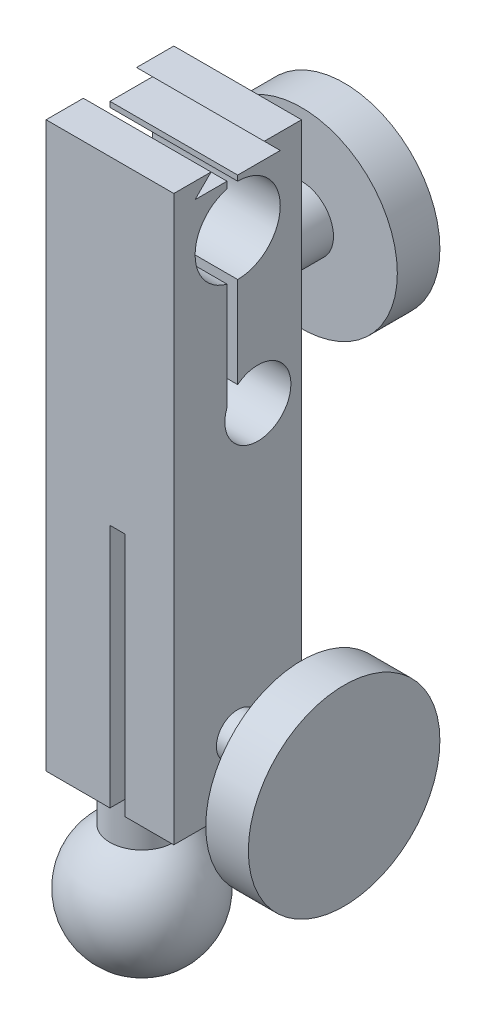
ISO-10303-21;
HEADER;
FILE_DESCRIPTION(('STEP AP214'),'2;1');
FILE_NAME('part.step','',(''),(''),'','','');
FILE_SCHEMA(('AUTOMOTIVE_DESIGN { 1 0 10303 214 1 1 1 1 }'));
ENDSEC;
DATA;
#1=APPLICATION_CONTEXT('core data for automotive mechanical design processes');
#2=APPLICATION_PROTOCOL_DEFINITION('international standard','automotive_design',2000,#1);
#3=PRODUCT_CONTEXT('',#1,'mechanical');
#4=PRODUCT('Part','Part','',(#3));
#5=PRODUCT_RELATED_PRODUCT_CATEGORY('part','',(#4));
#6=PRODUCT_DEFINITION_FORMATION('','',#4);
#7=PRODUCT_DEFINITION_CONTEXT('part definition',#1,'design');
#8=PRODUCT_DEFINITION('design','',#6,#7);
#9=PRODUCT_DEFINITION_SHAPE('','',#8);
#10=(LENGTH_UNIT() NAMED_UNIT(*) SI_UNIT(.MILLI.,.METRE.));
#11=(NAMED_UNIT(*) PLANE_ANGLE_UNIT() SI_UNIT($,.RADIAN.));
#12=(NAMED_UNIT(*) SI_UNIT($,.STERADIAN.) SOLID_ANGLE_UNIT());
#13=UNCERTAINTY_MEASURE_WITH_UNIT(LENGTH_MEASURE(1.E-05),#10,'distance_accuracy_value','');
#14=(GEOMETRIC_REPRESENTATION_CONTEXT(3) GLOBAL_UNCERTAINTY_ASSIGNED_CONTEXT((#13)) GLOBAL_UNIT_ASSIGNED_CONTEXT((#10,
#11,#12)) REPRESENTATION_CONTEXT('',''));
#15=CARTESIAN_POINT('',(0.,0.,0.));
#16=DIRECTION('',(0.,0.,1.));
#17=DIRECTION('',(1.,0.,0.));
#18=AXIS2_PLACEMENT_3D('',#15,#16,#17);
#19=CARTESIAN_POINT('',(-3.,64.,-2.5));
#20=DIRECTION('',(0.,1.,0.));
#21=DIRECTION('',(1.,0.,0.));
#22=AXIS2_PLACEMENT_3D('',#19,#20,#21);
#23=PLANE('',#22);
#24=DIRECTION('',(1.,0.,0.));
#25=VECTOR('',#24,1.);
#26=CARTESIAN_POINT('',(-3.,64.,-2.5));
#27=LINE('',#26,#25);
#28=CARTESIAN_POINT('',(9.,64.,-2.5));
#29=VERTEX_POINT('',#28);
#30=CARTESIAN_POINT('',(-3.,64.,-2.5));
#31=VERTEX_POINT('',#30);
#32=EDGE_CURVE('E162',#29,#31,#27,.F.);
#33=ORIENTED_EDGE('',*,*,#32,.F.);
#34=DIRECTION('',(0.,0.,-1.));
#35=VECTOR('',#34,1.);
#36=CARTESIAN_POINT('',(9.,64.,-2.5));
#37=LINE('',#36,#35);
#38=CARTESIAN_POINT('',(9.,64.,-6.));
#39=VERTEX_POINT('',#38);
#40=EDGE_CURVE('E177',#29,#39,#37,.T.);
#41=ORIENTED_EDGE('',*,*,#40,.T.);
#42=DIRECTION('',(-1.,0.,0.));
#43=VECTOR('',#42,1.);
#44=CARTESIAN_POINT('',(9.,64.,-6.));
#45=LINE('',#44,#43);
#46=CARTESIAN_POINT('',(-3.,64.,-6.));
#47=VERTEX_POINT('',#46);
#48=EDGE_CURVE('E186',#39,#47,#45,.T.);
#49=ORIENTED_EDGE('',*,*,#48,.T.);
#50=DIRECTION('',(0.,0.,1.));
#51=VECTOR('',#50,1.);
#52=CARTESIAN_POINT('',(-3.,64.,-6.));
#53=LINE('',#52,#51);
#54=EDGE_CURVE('E179',#31,#47,#53,.F.);
#55=ORIENTED_EDGE('',*,*,#54,.F.);
#56=EDGE_LOOP('',(#33,#41,#49,#55));
#57=FACE_BOUND('',#56,.T.);
#58=ADVANCED_FACE('F17',(#57),#23,.T.);
#59=CARTESIAN_POINT('',(-3.,64.,6.));
#60=DIRECTION('',(0.,1.,0.));
#61=DIRECTION('',(1.,0.,0.));
#62=AXIS2_PLACEMENT_3D('',#59,#60,#61);
#63=PLANE('',#62);
#64=DIRECTION('',(-1.,0.,0.));
#65=VECTOR('',#64,1.);
#66=CARTESIAN_POINT('',(9.,64.,2.5));
#67=LINE('',#66,#65);
#68=CARTESIAN_POINT('',(9.,64.,2.5));
#69=VERTEX_POINT('',#68);
#70=CARTESIAN_POINT('',(-3.,64.,2.5));
#71=VERTEX_POINT('',#70);
#72=EDGE_CURVE('E197',#69,#71,#67,.T.);
#73=ORIENTED_EDGE('',*,*,#72,.T.);
#74=DIRECTION('',(0.,0.,1.));
#75=VECTOR('',#74,1.);
#76=CARTESIAN_POINT('',(-3.,64.,2.5));
#77=LINE('',#76,#75);
#78=CARTESIAN_POINT('',(-3.,64.,6.));
#79=VERTEX_POINT('',#78);
#80=EDGE_CURVE('E202',#79,#71,#77,.F.);
#81=ORIENTED_EDGE('',*,*,#80,.F.);
#82=DIRECTION('',(1.,0.,0.));
#83=VECTOR('',#82,1.);
#84=CARTESIAN_POINT('',(-3.,64.,6.));
#85=LINE('',#84,#83);
#86=CARTESIAN_POINT('',(9.,64.,6.));
#87=VERTEX_POINT('',#86);
#88=EDGE_CURVE('E207',#87,#79,#85,.F.);
#89=ORIENTED_EDGE('',*,*,#88,.F.);
#90=DIRECTION('',(0.,0.,-1.));
#91=VECTOR('',#90,1.);
#92=CARTESIAN_POINT('',(9.,64.,6.));
#93=LINE('',#92,#91);
#94=EDGE_CURVE('E211',#87,#69,#93,.T.);
#95=ORIENTED_EDGE('',*,*,#94,.T.);
#96=EDGE_LOOP('',(#73,#81,#89,#95));
#97=FACE_BOUND('',#96,.T.);
#98=ADVANCED_FACE('F538',(#97),#63,.T.);
#99=CARTESIAN_POINT('',(-3.,11.,6.));
#100=DIRECTION('',(-1.,0.,0.));
#101=DIRECTION('',(0.,1.,0.));
#102=AXIS2_PLACEMENT_3D('',#99,#100,#101);
#103=PLANE('',#102);
#104=DIRECTION('',(0.,0.707106781186548,0.707106781186547));
#105=VECTOR('',#104,1.);
#106=CARTESIAN_POINT('',(-3.,62.5,-4.));
#107=LINE('',#106,#105);
#108=CARTESIAN_POINT('',(-3.,62.5,-4.));
#109=VERTEX_POINT('',#108);
#110=EDGE_CURVE('E216',#109,#31,#107,.T.);
#111=ORIENTED_EDGE('',*,*,#110,.T.);
#112=ORIENTED_EDGE('',*,*,#54,.T.);
#113=DIRECTION('',(0.,-1.,0.));
#114=VECTOR('',#113,1.);
#115=CARTESIAN_POINT('',(-3.,64.,-6.));
#116=LINE('',#115,#114);
#117=CARTESIAN_POINT('',(-3.,11.,-6.));
#118=VERTEX_POINT('',#117);
#119=EDGE_CURVE('E220',#47,#118,#116,.T.);
#120=ORIENTED_EDGE('',*,*,#119,.T.);
#121=DIRECTION('',(0.,0.,1.));
#122=VECTOR('',#121,1.);
#123=CARTESIAN_POINT('',(-3.,11.,-6.));
#124=LINE('',#123,#122);
#125=CARTESIAN_POINT('',(-3.,11.,0.));
#126=VERTEX_POINT('',#125);
#127=EDGE_CURVE('E225',#126,#118,#124,.F.);
#128=ORIENTED_EDGE('',*,*,#127,.F.);
#129=DIRECTION('',(0.,0.,1.));
#130=VECTOR('',#129,1.);
#131=CARTESIAN_POINT('',(-3.,11.,0.));
#132=LINE('',#131,#130);
#133=CARTESIAN_POINT('',(-3.,11.,6.));
#134=VERTEX_POINT('',#133);
#135=EDGE_CURVE('E230',#134,#126,#132,.F.);
#136=ORIENTED_EDGE('',*,*,#135,.F.);
#137=DIRECTION('',(0.,1.,0.));
#138=VECTOR('',#137,1.);
#139=CARTESIAN_POINT('',(-3.,11.,6.));
#140=LINE('',#139,#138);
#141=EDGE_CURVE('E235',#79,#134,#140,.F.);
#142=ORIENTED_EDGE('',*,*,#141,.F.);
#143=ORIENTED_EDGE('',*,*,#80,.T.);
#144=DIRECTION('',(0.,-0.707106781186548,0.707106781186547));
#145=VECTOR('',#144,1.);
#146=CARTESIAN_POINT('',(-3.,64.,2.5));
#147=LINE('',#146,#145);
#148=CARTESIAN_POINT('',(-3.,62.5,4.));
#149=VERTEX_POINT('',#148);
#150=EDGE_CURVE('E239',#71,#149,#147,.T.);
#151=ORIENTED_EDGE('',*,*,#150,.T.);
#152=DIRECTION('',(0.,0.,-1.));
#153=VECTOR('',#152,1.);
#154=CARTESIAN_POINT('',(-3.,62.5,4.));
#155=LINE('',#154,#153);
#156=CARTESIAN_POINT('',(-3.,62.5,1.));
#157=VERTEX_POINT('',#156);
#158=EDGE_CURVE('E244',#149,#157,#155,.T.);
#159=ORIENTED_EDGE('',*,*,#158,.T.);
#160=DIRECTION('',(0.,-1.,0.));
#161=VECTOR('',#160,1.);
#162=CARTESIAN_POINT('',(-3.,62.5,1.));
#163=LINE('',#162,#161);
#164=CARTESIAN_POINT('',(-3.,61.872983346207,1.));
#165=VERTEX_POINT('',#164);
#166=EDGE_CURVE('E249',#157,#165,#163,.T.);
#167=ORIENTED_EDGE('',*,*,#166,.T.);
#168=CARTESIAN_POINT('',(-3.,58.,5.41667405373758E-13));
#169=DIRECTION('',(1.,0.,0.));
#170=DIRECTION('',(0.,0.96824583655188,0.249999999999899));
#171=AXIS2_PLACEMENT_3D('',#168,#169,#170);
#172=CIRCLE('',#171,3.99999999999946);
#173=CARTESIAN_POINT('',(-3.,54.127016653793,1.));
#174=VERTEX_POINT('',#173);
#175=EDGE_CURVE('E254',#165,#174,#172,.T.);
#176=ORIENTED_EDGE('',*,*,#175,.T.);
#177=DIRECTION('',(0.,-1.,0.));
#178=VECTOR('',#177,1.);
#179=CARTESIAN_POINT('',(-3.,54.127016653793,1.));
#180=LINE('',#179,#178);
#181=CARTESIAN_POINT('',(-3.,44.09544511501,1.00000000000002));
#182=VERTEX_POINT('',#181);
#183=EDGE_CURVE('E259',#174,#182,#180,.T.);
#184=ORIENTED_EDGE('',*,*,#183,.T.);
#185=CARTESIAN_POINT('',(-3.,43.,-1.90000000000005));
#186=DIRECTION('',(1.,0.,0.));
#187=DIRECTION('',(0.,-0.59407775007166,-0.804407624820771));
#188=AXIS2_PLACEMENT_3D('',#185,#186,#187);
#189=CIRCLE('',#188,3.09999999999997);
#190=CARTESIAN_POINT('',(-3.,45.4494897427831,0.));
#191=VERTEX_POINT('',#190);
#192=EDGE_CURVE('E264',#182,#191,#189,.T.);
#193=ORIENTED_EDGE('',*,*,#192,.T.);
#194=DIRECTION('',(0.,1.,0.));
#195=VECTOR('',#194,1.);
#196=CARTESIAN_POINT('',(-3.,45.449489742783,0.));
#197=LINE('',#196,#195);
#198=CARTESIAN_POINT('',(-3.,54.,0.));
#199=VERTEX_POINT('',#198);
#200=EDGE_CURVE('E269',#191,#199,#197,.T.);
#201=ORIENTED_EDGE('',*,*,#200,.T.);
#202=CARTESIAN_POINT('',(-3.,58.,0.));
#203=DIRECTION('',(1.,0.,0.));
#204=DIRECTION('',(0.,-1.,0.));
#205=AXIS2_PLACEMENT_3D('',#202,#203,#204);
#206=CIRCLE('',#205,4.);
#207=CARTESIAN_POINT('',(-3.,62.,0.));
#208=VERTEX_POINT('',#207);
#209=EDGE_CURVE('E274',#199,#208,#206,.T.);
#210=ORIENTED_EDGE('',*,*,#209,.T.);
#211=DIRECTION('',(0.,1.,0.));
#212=VECTOR('',#211,1.);
#213=CARTESIAN_POINT('',(-3.,62.,0.));
#214=LINE('',#213,#212);
#215=CARTESIAN_POINT('',(-3.,62.5,0.));
#216=VERTEX_POINT('',#215);
#217=EDGE_CURVE('E279',#208,#216,#214,.T.);
#218=ORIENTED_EDGE('',*,*,#217,.T.);
#219=DIRECTION('',(0.,0.,-1.));
#220=VECTOR('',#219,1.);
#221=CARTESIAN_POINT('',(-3.,62.5,0.));
#222=LINE('',#221,#220);
#223=EDGE_CURVE('E171',#216,#109,#222,.T.);
#224=ORIENTED_EDGE('',*,*,#223,.T.);
#225=EDGE_LOOP('',(#111,#112,#120,#128,#136,#142,#143,#151,#159,#167,#176,#184,#193,#201,#210,
#218,#224));
#226=FACE_BOUND('',#225,.T.);
#227=ADVANCED_FACE('F543',(#226),#103,.T.);
#228=CARTESIAN_POINT('',(9.,11.,-6.));
#229=DIRECTION('',(1.,0.,0.));
#230=DIRECTION('',(0.,1.,0.));
#231=AXIS2_PLACEMENT_3D('',#228,#229,#230);
#232=PLANE('',#231);
#233=DIRECTION('',(0.,-0.707106781186548,-0.707106781186547));
#234=VECTOR('',#233,1.);
#235=CARTESIAN_POINT('',(9.,64.,-2.5));
#236=LINE('',#235,#234);
#237=CARTESIAN_POINT('',(9.,62.5,-4.));
#238=VERTEX_POINT('',#237);
#239=EDGE_CURVE('E159',#238,#29,#236,.F.);
#240=ORIENTED_EDGE('',*,*,#239,.F.);
#241=DIRECTION('',(0.,0.,1.));
#242=VECTOR('',#241,1.);
#243=CARTESIAN_POINT('',(9.,62.5,-4.));
#244=LINE('',#243,#242);
#245=CARTESIAN_POINT('',(9.,62.5,0.));
#246=VERTEX_POINT('',#245);
#247=EDGE_CURVE('E170',#246,#238,#244,.F.);
#248=ORIENTED_EDGE('',*,*,#247,.F.);
#249=DIRECTION('',(0.,-1.,0.));
#250=VECTOR('',#249,1.);
#251=CARTESIAN_POINT('',(9.,62.5,0.));
#252=LINE('',#251,#250);
#253=CARTESIAN_POINT('',(9.,62.,0.));
#254=VERTEX_POINT('',#253);
#255=EDGE_CURVE('E293',#254,#246,#252,.F.);
#256=ORIENTED_EDGE('',*,*,#255,.F.);
#257=CARTESIAN_POINT('',(9.,58.,0.));
#258=DIRECTION('',(-1.,0.,0.));
#259=DIRECTION('',(0.,1.,0.));
#260=AXIS2_PLACEMENT_3D('',#257,#258,#259);
#261=CIRCLE('',#260,4.);
#262=CARTESIAN_POINT('',(9.,54.,0.));
#263=VERTEX_POINT('',#262);
#264=EDGE_CURVE('E298',#263,#254,#261,.F.);
#265=ORIENTED_EDGE('',*,*,#264,.F.);
#266=DIRECTION('',(0.,-1.,0.));
#267=VECTOR('',#266,1.);
#268=CARTESIAN_POINT('',(9.,54.,0.));
#269=LINE('',#268,#267);
#270=CARTESIAN_POINT('',(9.,45.449489742783,0.));
#271=VERTEX_POINT('',#270);
#272=EDGE_CURVE('E303',#271,#263,#269,.F.);
#273=ORIENTED_EDGE('',*,*,#272,.F.);
#274=CARTESIAN_POINT('',(9.,43.,-1.90000000000005));
#275=DIRECTION('',(-1.,0.,0.));
#276=DIRECTION('',(0.,-0.594077699285333,-0.804407662327906));
#277=AXIS2_PLACEMENT_3D('',#274,#275,#276);
#278=CIRCLE('',#277,3.09999999999997);
#279=CARTESIAN_POINT('',(9.,44.09544511501,1.00000000000003));
#280=VERTEX_POINT('',#279);
#281=EDGE_CURVE('E308',#280,#271,#278,.F.);
#282=ORIENTED_EDGE('',*,*,#281,.F.);
#283=DIRECTION('',(0.,1.,0.));
#284=VECTOR('',#283,1.);
#285=CARTESIAN_POINT('',(9.,44.09544511501,1.00000000000001));
#286=LINE('',#285,#284);
#287=CARTESIAN_POINT('',(9.,54.127016653793,0.999999999999999));
#288=VERTEX_POINT('',#287);
#289=EDGE_CURVE('E313',#288,#280,#286,.F.);
#290=ORIENTED_EDGE('',*,*,#289,.F.);
#291=CARTESIAN_POINT('',(9.,58.,5.41667405373758E-13));
#292=DIRECTION('',(-1.,0.,0.));
#293=DIRECTION('',(0.,-0.968245836551881,0.249999999999898));
#294=AXIS2_PLACEMENT_3D('',#291,#292,#293);
#295=CIRCLE('',#294,3.99999999999946);
#296=CARTESIAN_POINT('',(9.,61.872983346207,1.));
#297=VERTEX_POINT('',#296);
#298=EDGE_CURVE('E318',#297,#288,#295,.F.);
#299=ORIENTED_EDGE('',*,*,#298,.F.);
#300=DIRECTION('',(0.,1.,0.));
#301=VECTOR('',#300,1.);
#302=CARTESIAN_POINT('',(9.,61.872983346207,0.999999999999999));
#303=LINE('',#302,#301);
#304=CARTESIAN_POINT('',(9.,62.5,0.999999999999999));
#305=VERTEX_POINT('',#304);
#306=EDGE_CURVE('E323',#305,#297,#303,.F.);
#307=ORIENTED_EDGE('',*,*,#306,.F.);
#308=DIRECTION('',(0.,0.,1.));
#309=VECTOR('',#308,1.);
#310=CARTESIAN_POINT('',(9.,62.5,0.999999999999999));
#311=LINE('',#310,#309);
#312=CARTESIAN_POINT('',(9.,62.5,4.));
#313=VERTEX_POINT('',#312);
#314=EDGE_CURVE('E328',#313,#305,#311,.F.);
#315=ORIENTED_EDGE('',*,*,#314,.F.);
#316=DIRECTION('',(0.,0.707106781186548,-0.707106781186547));
#317=VECTOR('',#316,1.);
#318=CARTESIAN_POINT('',(9.,62.5,4.));
#319=LINE('',#318,#317);
#320=EDGE_CURVE('E332',#69,#313,#319,.F.);
#321=ORIENTED_EDGE('',*,*,#320,.F.);
#322=ORIENTED_EDGE('',*,*,#94,.F.);
#323=DIRECTION('',(0.,-1.,0.));
#324=VECTOR('',#323,1.);
#325=CARTESIAN_POINT('',(9.,64.,6.));
#326=LINE('',#325,#324);
#327=CARTESIAN_POINT('',(9.,11.,6.));
#328=VERTEX_POINT('',#327);
#329=EDGE_CURVE('E337',#328,#87,#326,.F.);
#330=ORIENTED_EDGE('',*,*,#329,.F.);
#331=DIRECTION('',(0.,0.,-1.));
#332=VECTOR('',#331,1.);
#333=CARTESIAN_POINT('',(9.,11.,6.));
#334=LINE('',#333,#332);
#335=CARTESIAN_POINT('',(9.,11.,-6.));
#336=VERTEX_POINT('',#335);
#337=EDGE_CURVE('E341',#328,#336,#334,.T.);
#338=ORIENTED_EDGE('',*,*,#337,.T.);
#339=DIRECTION('',(0.,1.,0.));
#340=VECTOR('',#339,1.);
#341=CARTESIAN_POINT('',(9.,11.,-6.));
#342=LINE('',#341,#340);
#343=EDGE_CURVE('E185',#336,#39,#342,.T.);
#344=ORIENTED_EDGE('',*,*,#343,.T.);
#345=ORIENTED_EDGE('',*,*,#40,.F.);
#346=EDGE_LOOP('',(#240,#248,#256,#265,#273,#282,#290,#299,#307,#315,#321,#322,#330,#338,#344,#345));
#347=FACE_BOUND('',#346,.T.);
#348=CARTESIAN_POINT('',(9.,17.,0.));
#349=DIRECTION('',(-1.,0.,0.));
#350=DIRECTION('',(0.,-1.42053924179211E-07,-0.99999999999999));
#351=AXIS2_PLACEMENT_3D('',#348,#349,#350);
#352=CIRCLE('',#351,2.);
#353=CARTESIAN_POINT('',(9.,16.9999997158922,-1.99999999999998));
#354=VERTEX_POINT('',#353);
#355=EDGE_CURVE('E348',#354,#354,#352,.F.);
#356=ORIENTED_EDGE('',*,*,#355,.F.);
#357=EDGE_LOOP('',(#356));
#358=FACE_BOUND('',#357,.T.);
#359=ADVANCED_FACE('F182',(#347,#358),#232,.T.);
#360=CARTESIAN_POINT('',(-3.,11.,-6.));
#361=DIRECTION('',(0.,-1.,0.));
#362=DIRECTION('',(1.,0.,0.));
#363=AXIS2_PLACEMENT_3D('',#360,#361,#362);
#364=PLANE('',#363);
#365=DIRECTION('',(0.,0.,1.));
#366=VECTOR('',#365,1.);
#367=CARTESIAN_POINT('',(3.,11.,-6.));
#368=LINE('',#367,#366);
#369=CARTESIAN_POINT('',(3.,11.,0.));
#370=VERTEX_POINT('',#369);
#371=CARTESIAN_POINT('',(3.,11.,-6.));
#372=VERTEX_POINT('',#371);
#373=EDGE_CURVE('E353',#370,#372,#368,.F.);
#374=ORIENTED_EDGE('',*,*,#373,.F.);
#375=CARTESIAN_POINT('',(0.,11.,0.));
#376=DIRECTION('',(0.,1.,0.));
#377=DIRECTION('',(0.,0.,-1.));
#378=AXIS2_PLACEMENT_3D('',#375,#376,#377);
#379=CIRCLE('',#378,3.);
#380=EDGE_CURVE('E356',#126,#370,#379,.F.);
#381=ORIENTED_EDGE('',*,*,#380,.F.);
#382=ORIENTED_EDGE('',*,*,#127,.T.);
#383=DIRECTION('',(1.,0.,0.));
#384=VECTOR('',#383,1.);
#385=CARTESIAN_POINT('',(-3.,11.,-6.));
#386=LINE('',#385,#384);
#387=EDGE_CURVE('E361',#118,#372,#386,.T.);
#388=ORIENTED_EDGE('',*,*,#387,.T.);
#389=EDGE_LOOP('',(#374,#381,#382,#388));
#390=FACE_BOUND('',#389,.T.);
#391=ADVANCED_FACE('F552',(#390),#364,.T.);
#392=CARTESIAN_POINT('',(-3.,11.,0.));
#393=DIRECTION('',(0.,-1.,0.));
#394=DIRECTION('',(1.,0.,0.));
#395=AXIS2_PLACEMENT_3D('',#392,#393,#394);
#396=PLANE('',#395);
#397=ORIENTED_EDGE('',*,*,#135,.T.);
#398=CARTESIAN_POINT('',(0.,11.,0.));
#399=DIRECTION('',(0.,1.,0.));
#400=DIRECTION('',(0.,0.,1.));
#401=AXIS2_PLACEMENT_3D('',#398,#399,#400);
#402=CIRCLE('',#401,3.);
#403=EDGE_CURVE('E366',#370,#126,#402,.F.);
#404=ORIENTED_EDGE('',*,*,#403,.F.);
#405=DIRECTION('',(0.,0.,1.));
#406=VECTOR('',#405,1.);
#407=CARTESIAN_POINT('',(3.,11.,0.));
#408=LINE('',#407,#406);
#409=CARTESIAN_POINT('',(3.,11.,6.));
#410=VERTEX_POINT('',#409);
#411=EDGE_CURVE('E370',#410,#370,#408,.F.);
#412=ORIENTED_EDGE('',*,*,#411,.F.);
#413=DIRECTION('',(-1.,0.,0.));
#414=VECTOR('',#413,1.);
#415=CARTESIAN_POINT('',(3.,11.,6.));
#416=LINE('',#415,#414);
#417=EDGE_CURVE('E374',#134,#410,#416,.F.);
#418=ORIENTED_EDGE('',*,*,#417,.F.);
#419=EDGE_LOOP('',(#397,#404,#412,#418));
#420=FACE_BOUND('',#419,.T.);
#421=ADVANCED_FACE('F555',(#420),#396,.T.);
#422=CARTESIAN_POINT('',(3.,11.,-6.));
#423=DIRECTION('',(1.,0.,0.));
#424=DIRECTION('',(0.,1.,0.));
#425=AXIS2_PLACEMENT_3D('',#422,#423,#424);
#426=PLANE('',#425);
#427=DIRECTION('',(0.,1.,0.));
#428=VECTOR('',#427,1.);
#429=CARTESIAN_POINT('',(3.,11.,-6.));
#430=LINE('',#429,#428);
#431=CARTESIAN_POINT('',(3.,34.,-6.));
#432=VERTEX_POINT('',#431);
#433=EDGE_CURVE('E378',#372,#432,#430,.T.);
#434=ORIENTED_EDGE('',*,*,#433,.T.);
#435=DIRECTION('',(0.,0.,1.));
#436=VECTOR('',#435,1.);
#437=CARTESIAN_POINT('',(3.,34.,-6.));
#438=LINE('',#437,#436);
#439=CARTESIAN_POINT('',(3.,34.,6.));
#440=VERTEX_POINT('',#439);
#441=EDGE_CURVE('E383',#440,#432,#438,.F.);
#442=ORIENTED_EDGE('',*,*,#441,.F.);
#443=DIRECTION('',(0.,-1.,0.));
#444=VECTOR('',#443,1.);
#445=CARTESIAN_POINT('',(3.,34.,6.));
#446=LINE('',#445,#444);
#447=EDGE_CURVE('E388',#410,#440,#446,.F.);
#448=ORIENTED_EDGE('',*,*,#447,.F.);
#449=ORIENTED_EDGE('',*,*,#411,.T.);
#450=ORIENTED_EDGE('',*,*,#373,.T.);
#451=EDGE_LOOP('',(#434,#442,#448,#449,#450));
#452=FACE_BOUND('',#451,.T.);
#453=CARTESIAN_POINT('',(3.,17.,0.));
#454=DIRECTION('',(-1.,0.,0.));
#455=DIRECTION('',(0.,-1.4205391885014E-07,-0.99999999999999));
#456=AXIS2_PLACEMENT_3D('',#453,#454,#455);
#457=CIRCLE('',#456,2.);
#458=CARTESIAN_POINT('',(3.,16.9999997158922,-1.99999999999998));
#459=VERTEX_POINT('',#458);
#460=EDGE_CURVE('E392',#459,#459,#457,.F.);
#461=ORIENTED_EDGE('',*,*,#460,.F.);
#462=EDGE_LOOP('',(#461));
#463=FACE_BOUND('',#462,.T.);
#464=ADVANCED_FACE('F559',(#452,#463),#426,.T.);
#465=CARTESIAN_POINT('',(3.,34.,-6.));
#466=DIRECTION('',(0.,-1.,0.));
#467=DIRECTION('',(1.,0.,0.));
#468=AXIS2_PLACEMENT_3D('',#465,#466,#467);
#469=PLANE('',#468);
#470=DIRECTION('',(1.,0.,0.));
#471=VECTOR('',#470,1.);
#472=CARTESIAN_POINT('',(3.,34.,-6.));
#473=LINE('',#472,#471);
#474=CARTESIAN_POINT('',(4.4,34.,-6.));
#475=VERTEX_POINT('',#474);
#476=EDGE_CURVE('E397',#432,#475,#473,.T.);
#477=ORIENTED_EDGE('',*,*,#476,.T.);
#478=DIRECTION('',(0.,0.,1.));
#479=VECTOR('',#478,1.);
#480=CARTESIAN_POINT('',(4.4,34.,-6.));
#481=LINE('',#480,#479);
#482=CARTESIAN_POINT('',(4.4,34.,6.));
#483=VERTEX_POINT('',#482);
#484=EDGE_CURVE('E400',#483,#475,#481,.F.);
#485=ORIENTED_EDGE('',*,*,#484,.F.);
#486=DIRECTION('',(-1.,0.,0.));
#487=VECTOR('',#486,1.);
#488=CARTESIAN_POINT('',(4.4,34.,6.));
#489=LINE('',#488,#487);
#490=EDGE_CURVE('E405',#440,#483,#489,.F.);
#491=ORIENTED_EDGE('',*,*,#490,.F.);
#492=ORIENTED_EDGE('',*,*,#441,.T.);
#493=EDGE_LOOP('',(#477,#485,#491,#492));
#494=FACE_BOUND('',#493,.T.);
#495=ADVANCED_FACE('F563',(#494),#469,.T.);
#496=CARTESIAN_POINT('',(4.4,11.,6.));
#497=DIRECTION('',(-1.,0.,0.));
#498=DIRECTION('',(0.,1.,0.));
#499=AXIS2_PLACEMENT_3D('',#496,#497,#498);
#500=PLANE('',#499);
#501=DIRECTION('',(0.,-1.,0.));
#502=VECTOR('',#501,1.);
#503=CARTESIAN_POINT('',(4.4,34.,-6.));
#504=LINE('',#503,#502);
#505=CARTESIAN_POINT('',(4.4,11.,-6.));
#506=VERTEX_POINT('',#505);
#507=EDGE_CURVE('E409',#475,#506,#504,.T.);
#508=ORIENTED_EDGE('',*,*,#507,.T.);
#509=DIRECTION('',(0.,0.,1.));
#510=VECTOR('',#509,1.);
#511=CARTESIAN_POINT('',(4.4,11.,-6.));
#512=LINE('',#511,#510);
#513=CARTESIAN_POINT('',(4.4,11.,6.));
#514=VERTEX_POINT('',#513);
#515=EDGE_CURVE('E413',#514,#506,#512,.F.);
#516=ORIENTED_EDGE('',*,*,#515,.F.);
#517=DIRECTION('',(0.,1.,0.));
#518=VECTOR('',#517,1.);
#519=CARTESIAN_POINT('',(4.4,11.,6.));
#520=LINE('',#519,#518);
#521=EDGE_CURVE('E32',#483,#514,#520,.F.);
#522=ORIENTED_EDGE('',*,*,#521,.F.);
#523=ORIENTED_EDGE('',*,*,#484,.T.);
#524=EDGE_LOOP('',(#508,#516,#522,#523));
#525=FACE_BOUND('',#524,.T.);
#526=CARTESIAN_POINT('',(4.4,17.,0.));
#527=DIRECTION('',(1.,0.,0.));
#528=DIRECTION('',(0.,-1.42053893981144E-07,0.99999999999999));
#529=AXIS2_PLACEMENT_3D('',#526,#527,#528);
#530=CIRCLE('',#529,2.);
#531=CARTESIAN_POINT('',(4.4,16.9999997158922,1.99999999999998));
#532=VERTEX_POINT('',#531);
#533=EDGE_CURVE('E421',#532,#532,#530,.F.);
#534=ORIENTED_EDGE('',*,*,#533,.F.);
#535=EDGE_LOOP('',(#534));
#536=FACE_BOUND('',#535,.T.);
#537=ADVANCED_FACE('F567',(#525,#536),#500,.T.);
#538=CARTESIAN_POINT('',(4.4,11.,-6.));
#539=DIRECTION('',(0.,-1.,0.));
#540=DIRECTION('',(1.,0.,0.));
#541=AXIS2_PLACEMENT_3D('',#538,#539,#540);
#542=PLANE('',#541);
#543=DIRECTION('',(1.,0.,0.));
#544=VECTOR('',#543,1.);
#545=CARTESIAN_POINT('',(4.4,11.,-6.));
#546=LINE('',#545,#544);
#547=EDGE_CURVE('E40',#506,#336,#546,.T.);
#548=ORIENTED_EDGE('',*,*,#547,.T.);
#549=ORIENTED_EDGE('',*,*,#337,.F.);
#550=DIRECTION('',(-1.,0.,0.));
#551=VECTOR('',#550,1.);
#552=CARTESIAN_POINT('',(9.,11.,6.));
#553=LINE('',#552,#551);
#554=EDGE_CURVE('E427',#514,#328,#553,.F.);
#555=ORIENTED_EDGE('',*,*,#554,.F.);
#556=ORIENTED_EDGE('',*,*,#515,.T.);
#557=EDGE_LOOP('',(#548,#549,#555,#556));
#558=FACE_BOUND('',#557,.T.);
#559=ADVANCED_FACE('F571',(#558),#542,.T.);
#560=CARTESIAN_POINT('',(-3.,11.,6.));
#561=DIRECTION('',(0.,0.,1.));
#562=DIRECTION('',(1.,0.,0.));
#563=AXIS2_PLACEMENT_3D('',#560,#561,#562);
#564=PLANE('',#563);
#565=ORIENTED_EDGE('',*,*,#88,.T.);
#566=ORIENTED_EDGE('',*,*,#141,.T.);
#567=ORIENTED_EDGE('',*,*,#417,.T.);
#568=ORIENTED_EDGE('',*,*,#447,.T.);
#569=ORIENTED_EDGE('',*,*,#490,.T.);
#570=ORIENTED_EDGE('',*,*,#521,.T.);
#571=ORIENTED_EDGE('',*,*,#554,.T.);
#572=ORIENTED_EDGE('',*,*,#329,.T.);
#573=EDGE_LOOP('',(#565,#566,#567,#568,#569,#570,#571,#572));
#574=FACE_BOUND('',#573,.T.);
#575=ADVANCED_FACE('F575',(#574),#564,.T.);
#576=CARTESIAN_POINT('',(-3.,11.,-6.));
#577=DIRECTION('',(0.,0.,-1.));
#578=DIRECTION('',(0.,1.,0.));
#579=AXIS2_PLACEMENT_3D('',#576,#577,#578);
#580=PLANE('',#579);
#581=ORIENTED_EDGE('',*,*,#48,.F.);
#582=ORIENTED_EDGE('',*,*,#343,.F.);
#583=ORIENTED_EDGE('',*,*,#547,.F.);
#584=ORIENTED_EDGE('',*,*,#507,.F.);
#585=ORIENTED_EDGE('',*,*,#476,.F.);
#586=ORIENTED_EDGE('',*,*,#433,.F.);
#587=ORIENTED_EDGE('',*,*,#387,.F.);
#588=ORIENTED_EDGE('',*,*,#119,.F.);
#589=EDGE_LOOP('',(#581,#582,#583,#584,#585,#586,#587,#588));
#590=FACE_BOUND('',#589,.T.);
#591=CARTESIAN_POINT('',(3.,50.,-6.));
#592=DIRECTION('',(0.,0.,1.));
#593=DIRECTION('',(-0.99999999999999,-1.42053934837352E-07,0.));
#594=AXIS2_PLACEMENT_3D('',#591,#592,#593);
#595=CIRCLE('',#594,2.);
#596=CARTESIAN_POINT('',(1.00000000000002,49.9999997158921,-6.));
#597=VERTEX_POINT('',#596);
#598=EDGE_CURVE('E431',#597,#597,#595,.F.);
#599=ORIENTED_EDGE('',*,*,#598,.F.);
#600=EDGE_LOOP('',(#599));
#601=FACE_BOUND('',#600,.T.);
#602=ADVANCED_FACE('F579',(#590,#601),#580,.T.);
#603=CARTESIAN_POINT('',(9.,61.872983346207,1.));
#604=DIRECTION('',(0.,0.,-1.));
#605=DIRECTION('',(-1.,0.,0.));
#606=AXIS2_PLACEMENT_3D('',#603,#604,#605);
#607=PLANE('',#606);
#608=ORIENTED_EDGE('',*,*,#166,.F.);
#609=DIRECTION('',(1.,0.,0.));
#610=VECTOR('',#609,1.);
#611=CARTESIAN_POINT('',(-3.,62.5,1.));
#612=LINE('',#611,#610);
#613=EDGE_CURVE('E436',#305,#157,#612,.F.);
#614=ORIENTED_EDGE('',*,*,#613,.F.);
#615=ORIENTED_EDGE('',*,*,#306,.T.);
#616=DIRECTION('',(-1.,0.,0.));
#617=VECTOR('',#616,1.);
#618=CARTESIAN_POINT('',(9.,61.872983346207,1.));
#619=LINE('',#618,#617);
#620=EDGE_CURVE('E438',#297,#165,#619,.T.);
#621=ORIENTED_EDGE('',*,*,#620,.T.);
#622=EDGE_LOOP('',(#608,#614,#615,#621));
#623=FACE_BOUND('',#622,.T.);
#624=ADVANCED_FACE('F582',(#623),#607,.T.);
#625=CARTESIAN_POINT('',(9.,58.,5.41667405373758E-13));
#626=DIRECTION('',(-1.,0.,0.));
#627=DIRECTION('',(0.,-0.968245836551881,0.249999999999898));
#628=AXIS2_PLACEMENT_3D('',#625,#626,#627);
#629=CYLINDRICAL_SURFACE('',#628,3.99999999999946);
#630=ORIENTED_EDGE('',*,*,#175,.F.);
#631=ORIENTED_EDGE('',*,*,#620,.F.);
#632=ORIENTED_EDGE('',*,*,#298,.T.);
#633=DIRECTION('',(-1.,0.,0.));
#634=VECTOR('',#633,1.);
#635=CARTESIAN_POINT('',(9.,54.127016653793,0.999999999999999));
#636=LINE('',#635,#634);
#637=EDGE_CURVE('E443',#288,#174,#636,.T.);
#638=ORIENTED_EDGE('',*,*,#637,.T.);
#639=EDGE_LOOP('',(#630,#631,#632,#638));
#640=FACE_BOUND('',#639,.T.);
#641=ADVANCED_FACE('F585',(#640),#629,.F.);
#642=CARTESIAN_POINT('',(9.,44.09544511501,1.));
#643=DIRECTION('',(0.,0.,-1.));
#644=DIRECTION('',(-1.,0.,0.));
#645=AXIS2_PLACEMENT_3D('',#642,#643,#644);
#646=PLANE('',#645);
#647=ORIENTED_EDGE('',*,*,#183,.F.);
#648=ORIENTED_EDGE('',*,*,#637,.F.);
#649=ORIENTED_EDGE('',*,*,#289,.T.);
#650=DIRECTION('',(-1.,0.,0.));
#651=VECTOR('',#650,1.);
#652=CARTESIAN_POINT('',(9.,44.09544511501,1.));
#653=LINE('',#652,#651);
#654=EDGE_CURVE('E448',#280,#182,#653,.T.);
#655=ORIENTED_EDGE('',*,*,#654,.T.);
#656=EDGE_LOOP('',(#647,#648,#649,#655));
#657=FACE_BOUND('',#656,.T.);
#658=CARTESIAN_POINT('',(3.,50.,1.));
#659=DIRECTION('',(0.,0.,1.));
#660=DIRECTION('',(-1.,0.,0.));
#661=AXIS2_PLACEMENT_3D('',#658,#659,#660);
#662=CIRCLE('',#661,2.);
#663=CARTESIAN_POINT('',(1.,50.,1.));
#664=VERTEX_POINT('',#663);
#665=EDGE_CURVE('E453',#664,#664,#662,.T.);
#666=ORIENTED_EDGE('',*,*,#665,.T.);
#667=EDGE_LOOP('',(#666));
#668=FACE_BOUND('',#667,.T.);
#669=ADVANCED_FACE('F589',(#657,#668),#646,.T.);
#670=CARTESIAN_POINT('',(9.,43.,-1.90000000000005));
#671=DIRECTION('',(-1.,0.,0.));
#672=DIRECTION('',(0.,0.79015798154293,0.612903225806492));
#673=AXIS2_PLACEMENT_3D('',#670,#671,#672);
#674=CYLINDRICAL_SURFACE('',#673,3.09999999999997);
#675=DIRECTION('',(-1.,0.,0.));
#676=VECTOR('',#675,1.);
#677=CARTESIAN_POINT('',(9.,45.4494897427831,0.));
#678=LINE('',#677,#676);
#679=EDGE_CURVE('E458',#271,#191,#678,.T.);
#680=ORIENTED_EDGE('',*,*,#679,.T.);
#681=ORIENTED_EDGE('',*,*,#192,.F.);
#682=ORIENTED_EDGE('',*,*,#654,.F.);
#683=ORIENTED_EDGE('',*,*,#281,.T.);
#684=EDGE_LOOP('',(#680,#681,#682,#683));
#685=FACE_BOUND('',#684,.T.);
#686=ADVANCED_FACE('F593',(#685),#674,.F.);
#687=CARTESIAN_POINT('',(-3.,45.449489742783,0.));
#688=DIRECTION('',(0.,0.,1.));
#689=DIRECTION('',(1.,0.,0.));
#690=AXIS2_PLACEMENT_3D('',#687,#688,#689);
#691=PLANE('',#690);
#692=ORIENTED_EDGE('',*,*,#200,.F.);
#693=ORIENTED_EDGE('',*,*,#679,.F.);
#694=ORIENTED_EDGE('',*,*,#272,.T.);
#695=DIRECTION('',(-1.,0.,0.));
#696=VECTOR('',#695,1.);
#697=CARTESIAN_POINT('',(9.,54.,0.));
#698=LINE('',#697,#696);
#699=EDGE_CURVE('E461',#263,#199,#698,.T.);
#700=ORIENTED_EDGE('',*,*,#699,.T.);
#701=EDGE_LOOP('',(#692,#693,#694,#700));
#702=FACE_BOUND('',#701,.T.);
#703=CARTESIAN_POINT('',(3.,50.,0.));
#704=DIRECTION('',(0.,0.,-1.));
#705=DIRECTION('',(1.,0.,0.));
#706=AXIS2_PLACEMENT_3D('',#703,#704,#705);
#707=CIRCLE('',#706,2.);
#708=CARTESIAN_POINT('',(5.,50.,0.));
#709=VERTEX_POINT('',#708);
#710=EDGE_CURVE('E466',#709,#709,#707,.T.);
#711=ORIENTED_EDGE('',*,*,#710,.T.);
#712=EDGE_LOOP('',(#711));
#713=FACE_BOUND('',#712,.T.);
#714=ADVANCED_FACE('F597',(#702,#713),#691,.T.);
#715=CARTESIAN_POINT('',(9.,58.,0.));
#716=DIRECTION('',(-1.,0.,0.));
#717=DIRECTION('',(0.,1.,0.));
#718=AXIS2_PLACEMENT_3D('',#715,#716,#717);
#719=CYLINDRICAL_SURFACE('',#718,4.);
#720=ORIENTED_EDGE('',*,*,#209,.F.);
#721=ORIENTED_EDGE('',*,*,#699,.F.);
#722=ORIENTED_EDGE('',*,*,#264,.T.);
#723=DIRECTION('',(-1.,0.,0.));
#724=VECTOR('',#723,1.);
#725=CARTESIAN_POINT('',(9.,62.,0.));
#726=LINE('',#725,#724);
#727=EDGE_CURVE('E471',#254,#208,#726,.T.);
#728=ORIENTED_EDGE('',*,*,#727,.T.);
#729=EDGE_LOOP('',(#720,#721,#722,#728));
#730=FACE_BOUND('',#729,.T.);
#731=ADVANCED_FACE('F601',(#730),#719,.F.);
#732=CARTESIAN_POINT('',(-3.,62.,0.));
#733=DIRECTION('',(0.,0.,1.));
#734=DIRECTION('',(1.,0.,0.));
#735=AXIS2_PLACEMENT_3D('',#732,#733,#734);
#736=PLANE('',#735);
#737=ORIENTED_EDGE('',*,*,#217,.F.);
#738=ORIENTED_EDGE('',*,*,#727,.F.);
#739=ORIENTED_EDGE('',*,*,#255,.T.);
#740=DIRECTION('',(-1.,0.,0.));
#741=VECTOR('',#740,1.);
#742=CARTESIAN_POINT('',(9.,62.5,0.));
#743=LINE('',#742,#741);
#744=EDGE_CURVE('E474',#246,#216,#743,.T.);
#745=ORIENTED_EDGE('',*,*,#744,.T.);
#746=EDGE_LOOP('',(#737,#738,#739,#745));
#747=FACE_BOUND('',#746,.T.);
#748=ADVANCED_FACE('F605',(#747),#736,.T.);
#749=CARTESIAN_POINT('',(-3.,62.5,-4.));
#750=DIRECTION('',(0.,1.,0.));
#751=DIRECTION('',(0.,0.,1.));
#752=AXIS2_PLACEMENT_3D('',#749,#750,#751);
#753=PLANE('',#752);
#754=ORIENTED_EDGE('',*,*,#223,.F.);
#755=ORIENTED_EDGE('',*,*,#744,.F.);
#756=ORIENTED_EDGE('',*,*,#247,.T.);
#757=DIRECTION('',(-1.,0.,0.));
#758=VECTOR('',#757,1.);
#759=CARTESIAN_POINT('',(9.,62.5,-4.));
#760=LINE('',#759,#758);
#761=EDGE_CURVE('E165',#238,#109,#760,.T.);
#762=ORIENTED_EDGE('',*,*,#761,.T.);
#763=EDGE_LOOP('',(#754,#755,#756,#762));
#764=FACE_BOUND('',#763,.T.);
#765=ADVANCED_FACE('F609',(#764),#753,.T.);
#766=CARTESIAN_POINT('',(-3.,64.,-2.5));
#767=DIRECTION('',(0.,-0.707106781186547,0.707106781186548));
#768=DIRECTION('',(0.,-0.707106781186548,-0.707106781186547));
#769=AXIS2_PLACEMENT_3D('',#766,#767,#768);
#770=PLANE('',#769);
#771=ORIENTED_EDGE('',*,*,#110,.F.);
#772=ORIENTED_EDGE('',*,*,#761,.F.);
#773=ORIENTED_EDGE('',*,*,#239,.T.);
#774=ORIENTED_EDGE('',*,*,#32,.T.);
#775=EDGE_LOOP('',(#771,#772,#773,#774));
#776=FACE_BOUND('',#775,.T.);
#777=ADVANCED_FACE('F161',(#776),#770,.T.);
#778=CARTESIAN_POINT('',(-3.,62.5,4.));
#779=DIRECTION('',(0.,-0.707106781186547,-0.707106781186548));
#780=DIRECTION('',(0.,0.707106781186548,-0.707106781186547));
#781=AXIS2_PLACEMENT_3D('',#778,#779,#780);
#782=PLANE('',#781);
#783=ORIENTED_EDGE('',*,*,#150,.F.);
#784=ORIENTED_EDGE('',*,*,#72,.F.);
#785=ORIENTED_EDGE('',*,*,#320,.T.);
#786=DIRECTION('',(-1.,0.,0.));
#787=VECTOR('',#786,1.);
#788=CARTESIAN_POINT('',(9.,62.5,4.));
#789=LINE('',#788,#787);
#790=EDGE_CURVE('E482',#313,#149,#789,.T.);
#791=ORIENTED_EDGE('',*,*,#790,.T.);
#792=EDGE_LOOP('',(#783,#784,#785,#791));
#793=FACE_BOUND('',#792,.T.);
#794=ADVANCED_FACE('F616',(#793),#782,.T.);
#795=CARTESIAN_POINT('',(-3.,62.5,1.));
#796=DIRECTION('',(0.,1.,0.));
#797=DIRECTION('',(0.,0.,1.));
#798=AXIS2_PLACEMENT_3D('',#795,#796,#797);
#799=PLANE('',#798);
#800=ORIENTED_EDGE('',*,*,#158,.F.);
#801=ORIENTED_EDGE('',*,*,#790,.F.);
#802=ORIENTED_EDGE('',*,*,#314,.T.);
#803=ORIENTED_EDGE('',*,*,#613,.T.);
#804=EDGE_LOOP('',(#800,#801,#802,#803));
#805=FACE_BOUND('',#804,.T.);
#806=ADVANCED_FACE('F619',(#805),#799,.T.);
#807=CARTESIAN_POINT('',(10.5,14.5,2.5));
#808=DIRECTION('',(-1.,0.,0.));
#809=DIRECTION('',(0.,1.,0.));
#810=AXIS2_PLACEMENT_3D('',#807,#808,#809);
#811=PLANE('',#810);
#812=CARTESIAN_POINT('',(10.5,17.,0.));
#813=DIRECTION('',(-1.,0.,0.));
#814=DIRECTION('',(0.,0.,-1.));
#815=AXIS2_PLACEMENT_3D('',#812,#813,#814);
#816=CIRCLE('',#815,2.5);
#817=CARTESIAN_POINT('',(10.5,17.,-2.5));
#818=VERTEX_POINT('',#817);
#819=EDGE_CURVE('E487',#818,#818,#816,.F.);
#820=ORIENTED_EDGE('',*,*,#819,.F.);
#821=EDGE_LOOP('',(#820));
#822=FACE_BOUND('',#821,.T.);
#823=CARTESIAN_POINT('',(10.5,17.,0.));
#824=DIRECTION('',(1.,0.,0.));
#825=DIRECTION('',(0.,0.,1.));
#826=AXIS2_PLACEMENT_3D('',#823,#824,#825);
#827=CIRCLE('',#826,2.);
#828=CARTESIAN_POINT('',(10.5,17.,2.));
#829=VERTEX_POINT('',#828);
#830=EDGE_CURVE('E492',#829,#829,#827,.T.);
#831=ORIENTED_EDGE('',*,*,#830,.T.);
#832=EDGE_LOOP('',(#831));
#833=FACE_BOUND('',#832,.T.);
#834=ADVANCED_FACE('F623',(#822,#833),#811,.T.);
#835=CARTESIAN_POINT('',(15.,7.75408438107073,9.));
#836=DIRECTION('',(-1.,0.,0.));
#837=DIRECTION('',(0.,1.,0.));
#838=AXIS2_PLACEMENT_3D('',#835,#836,#837);
#839=PLANE('',#838);
#840=CARTESIAN_POINT('',(15.,17.,0.));
#841=DIRECTION('',(-1.,0.,0.));
#842=DIRECTION('',(0.,0.,-1.));
#843=AXIS2_PLACEMENT_3D('',#840,#841,#842);
#844=CIRCLE('',#843,9.);
#845=CARTESIAN_POINT('',(15.,17.,-9.));
#846=VERTEX_POINT('',#845);
#847=EDGE_CURVE('E495',#846,#846,#844,.F.);
#848=ORIENTED_EDGE('',*,*,#847,.F.);
#849=EDGE_LOOP('',(#848));
#850=FACE_BOUND('',#849,.T.);
#851=CARTESIAN_POINT('',(15.,17.,0.));
#852=DIRECTION('',(1.,0.,0.));
#853=DIRECTION('',(0.,-1.42053902152386E-07,0.99999999999999));
#854=AXIS2_PLACEMENT_3D('',#851,#852,#853);
#855=CIRCLE('',#854,2.5);
#856=CARTESIAN_POINT('',(15.,16.9999996448652,2.49999999999997));
#857=VERTEX_POINT('',#856);
#858=EDGE_CURVE('E498',#857,#857,#855,.T.);
#859=ORIENTED_EDGE('',*,*,#858,.T.);
#860=EDGE_LOOP('',(#859));
#861=FACE_BOUND('',#860,.T.);
#862=ADVANCED_FACE('F627',(#850,#861),#839,.T.);
#863=CARTESIAN_POINT('',(19.,7.75408439641999,-9.));
#864=DIRECTION('',(1.,0.,0.));
#865=DIRECTION('',(0.,1.,0.));
#866=AXIS2_PLACEMENT_3D('',#863,#864,#865);
#867=PLANE('',#866);
#868=CARTESIAN_POINT('',(19.,17.,0.));
#869=DIRECTION('',(1.,0.,0.));
#870=DIRECTION('',(0.,-1.16847844980031E-09,1.));
#871=AXIS2_PLACEMENT_3D('',#868,#869,#870);
#872=CIRCLE('',#871,9.);
#873=CARTESIAN_POINT('',(19.,16.9999999894837,9.));
#874=VERTEX_POINT('',#873);
#875=EDGE_CURVE('E501',#874,#874,#872,.T.);
#876=ORIENTED_EDGE('',*,*,#875,.T.);
#877=EDGE_LOOP('',(#876));
#878=FACE_BOUND('',#877,.T.);
#879=ADVANCED_FACE('F631',(#878),#867,.T.);
#880=CARTESIAN_POINT('',(-6.,40.7540843810707,-16.));
#881=DIRECTION('',(0.,0.,-1.));
#882=DIRECTION('',(0.,1.,0.));
#883=AXIS2_PLACEMENT_3D('',#880,#881,#882);
#884=PLANE('',#883);
#885=CARTESIAN_POINT('',(3.,50.,-16.));
#886=DIRECTION('',(0.,0.,-1.));
#887=DIRECTION('',(1.,0.,0.));
#888=AXIS2_PLACEMENT_3D('',#885,#886,#887);
#889=CIRCLE('',#888,9.);
#890=CARTESIAN_POINT('',(12.,50.,-16.));
#891=VERTEX_POINT('',#890);
#892=EDGE_CURVE('E504',#891,#891,#889,.F.);
#893=ORIENTED_EDGE('',*,*,#892,.F.);
#894=EDGE_LOOP('',(#893));
#895=FACE_BOUND('',#894,.T.);
#896=ADVANCED_FACE('F534',(#895),#884,.T.);
#897=CARTESIAN_POINT('',(12.,40.7540843810707,-12.));
#898=DIRECTION('',(0.,0.,1.));
#899=DIRECTION('',(0.,1.,0.));
#900=AXIS2_PLACEMENT_3D('',#897,#898,#899);
#901=PLANE('',#900);
#902=CARTESIAN_POINT('',(3.,50.,-12.));
#903=DIRECTION('',(0.,0.,1.));
#904=DIRECTION('',(-1.,0.,0.));
#905=AXIS2_PLACEMENT_3D('',#902,#903,#904);
#906=CIRCLE('',#905,9.);
#907=CARTESIAN_POINT('',(-6.,50.,-12.));
#908=VERTEX_POINT('',#907);
#909=EDGE_CURVE('E507',#908,#908,#906,.T.);
#910=ORIENTED_EDGE('',*,*,#909,.T.);
#911=EDGE_LOOP('',(#910));
#912=FACE_BOUND('',#911,.T.);
#913=CARTESIAN_POINT('',(3.,50.,-12.));
#914=DIRECTION('',(0.,0.,-1.));
#915=DIRECTION('',(1.,0.,0.));
#916=AXIS2_PLACEMENT_3D('',#913,#914,#915);
#917=CIRCLE('',#916,3.);
#918=CARTESIAN_POINT('',(6.,50.,-12.));
#919=VERTEX_POINT('',#918);
#920=EDGE_CURVE('E510',#919,#919,#917,.F.);
#921=ORIENTED_EDGE('',*,*,#920,.F.);
#922=EDGE_LOOP('',(#921));
#923=FACE_BOUND('',#922,.T.);
#924=ADVANCED_FACE('F523',(#912,#923),#901,.T.);
#925=CARTESIAN_POINT('',(6.,47.,-7.5));
#926=DIRECTION('',(0.,0.,1.));
#927=DIRECTION('',(0.,1.,0.));
#928=AXIS2_PLACEMENT_3D('',#925,#926,#927);
#929=PLANE('',#928);
#930=CARTESIAN_POINT('',(3.,50.,-7.5));
#931=DIRECTION('',(0.,0.,1.));
#932=DIRECTION('',(-1.,0.,0.));
#933=AXIS2_PLACEMENT_3D('',#930,#931,#932);
#934=CIRCLE('',#933,3.);
#935=CARTESIAN_POINT('',(0.,50.,-7.5));
#936=VERTEX_POINT('',#935);
#937=EDGE_CURVE('E513',#936,#936,#934,.T.);
#938=ORIENTED_EDGE('',*,*,#937,.T.);
#939=EDGE_LOOP('',(#938));
#940=FACE_BOUND('',#939,.T.);
#941=CARTESIAN_POINT('',(3.,50.,-7.5));
#942=DIRECTION('',(0.,0.,-1.));
#943=DIRECTION('',(1.,0.,0.));
#944=AXIS2_PLACEMENT_3D('',#941,#942,#943);
#945=CIRCLE('',#944,2.);
#946=CARTESIAN_POINT('',(5.,50.,-7.5));
#947=VERTEX_POINT('',#946);
#948=EDGE_CURVE('E25',#947,#947,#945,.F.);
#949=ORIENTED_EDGE('',*,*,#948,.F.);
#950=EDGE_LOOP('',(#949));
#951=FACE_BOUND('',#950,.T.);
#952=ADVANCED_FACE('F520',(#940,#951),#929,.T.);
#953=CARTESIAN_POINT('',(0.,-6.,0.));
#954=DIRECTION('',(0.,-1.,0.));
#955=DIRECTION('',(0.,0.,1.));
#956=AXIS2_PLACEMENT_3D('',#953,#954,#955);
#957=CYLINDRICAL_SURFACE('',#956,3.);
#958=CARTESIAN_POINT('',(0.,5.19615242270661,0.));
#959=DIRECTION('',(0.,1.,0.));
#960=DIRECTION('',(-1.,0.,0.));
#961=AXIS2_PLACEMENT_3D('',#958,#959,#960);
#962=CIRCLE('',#961,3.);
#963=CARTESIAN_POINT('',(-3.,5.19615242270661,0.));
#964=VERTEX_POINT('',#963);
#965=EDGE_CURVE('E11',#964,#964,#962,.F.);
#966=ORIENTED_EDGE('',*,*,#965,.F.);
#967=EDGE_LOOP('',(#966));
#968=FACE_BOUND('',#967,.T.);
#969=ORIENTED_EDGE('',*,*,#380,.T.);
#970=ORIENTED_EDGE('',*,*,#403,.T.);
#971=EDGE_LOOP('',(#969,#970));
#972=FACE_BOUND('',#971,.T.);
#973=ADVANCED_FACE('F522',(#968,#972),#957,.T.);
#974=CARTESIAN_POINT('',(0.,0.,0.));
#975=DIRECTION('',(0.,-1.,0.));
#976=DIRECTION('',(-1.,0.,0.));
#977=AXIS2_PLACEMENT_3D('',#974,#975,#976);
#978=SPHERICAL_SURFACE('',#977,6.);
#979=ORIENTED_EDGE('',*,*,#965,.T.);
#980=EDGE_LOOP('',(#979));
#981=FACE_BOUND('',#980,.T.);
#982=ADVANCED_FACE('F531',(#981),#978,.T.);
#983=CARTESIAN_POINT('',(19.,17.,0.));
#984=DIRECTION('',(1.,0.,0.));
#985=DIRECTION('',(0.,0.,1.));
#986=AXIS2_PLACEMENT_3D('',#983,#984,#985);
#987=CYLINDRICAL_SURFACE('',#986,2.);
#988=ORIENTED_EDGE('',*,*,#533,.T.);
#989=EDGE_LOOP('',(#988));
#990=FACE_BOUND('',#989,.T.);
#991=ORIENTED_EDGE('',*,*,#460,.T.);
#992=EDGE_LOOP('',(#991));
#993=FACE_BOUND('',#992,.T.);
#994=ADVANCED_FACE('F669',(#990,#993),#987,.T.);
#995=CARTESIAN_POINT('',(19.,17.,0.));
#996=DIRECTION('',(1.,0.,0.));
#997=DIRECTION('',(0.,0.,1.));
#998=AXIS2_PLACEMENT_3D('',#995,#996,#997);
#999=CYLINDRICAL_SURFACE('',#998,2.);
#1000=ORIENTED_EDGE('',*,*,#830,.F.);
#1001=EDGE_LOOP('',(#1000));
#1002=FACE_BOUND('',#1001,.T.);
#1003=ORIENTED_EDGE('',*,*,#355,.T.);
#1004=EDGE_LOOP('',(#1003));
#1005=FACE_BOUND('',#1004,.T.);
#1006=ADVANCED_FACE('F665',(#1002,#1005),#999,.T.);
#1007=CARTESIAN_POINT('',(19.,17.,0.));
#1008=DIRECTION('',(1.,0.,0.));
#1009=DIRECTION('',(0.,0.,1.));
#1010=AXIS2_PLACEMENT_3D('',#1007,#1008,#1009);
#1011=CYLINDRICAL_SURFACE('',#1010,2.5);
#1012=ORIENTED_EDGE('',*,*,#858,.F.);
#1013=EDGE_LOOP('',(#1012));
#1014=FACE_BOUND('',#1013,.T.);
#1015=ORIENTED_EDGE('',*,*,#819,.T.);
#1016=EDGE_LOOP('',(#1015));
#1017=FACE_BOUND('',#1016,.T.);
#1018=ADVANCED_FACE('F661',(#1014,#1017),#1011,.T.);
#1019=CARTESIAN_POINT('',(19.,17.,0.));
#1020=DIRECTION('',(1.,0.,0.));
#1021=DIRECTION('',(0.,0.,1.));
#1022=AXIS2_PLACEMENT_3D('',#1019,#1020,#1021);
#1023=CYLINDRICAL_SURFACE('',#1022,9.);
#1024=ORIENTED_EDGE('',*,*,#875,.F.);
#1025=EDGE_LOOP('',(#1024));
#1026=FACE_BOUND('',#1025,.T.);
#1027=ORIENTED_EDGE('',*,*,#847,.T.);
#1028=EDGE_LOOP('',(#1027));
#1029=FACE_BOUND('',#1028,.T.);
#1030=ADVANCED_FACE('F657',(#1026,#1029),#1023,.T.);
#1031=CARTESIAN_POINT('',(3.,50.,3.));
#1032=DIRECTION('',(0.,0.,1.));
#1033=DIRECTION('',(-0.99999999999999,1.42053885221822E-07,0.));
#1034=AXIS2_PLACEMENT_3D('',#1031,#1032,#1033);
#1035=CYLINDRICAL_SURFACE('',#1034,2.);
#1036=ORIENTED_EDGE('',*,*,#665,.F.);
#1037=EDGE_LOOP('',(#1036));
#1038=FACE_BOUND('',#1037,.T.);
#1039=ORIENTED_EDGE('',*,*,#710,.F.);
#1040=EDGE_LOOP('',(#1039));
#1041=FACE_BOUND('',#1040,.T.);
#1042=ADVANCED_FACE('F650',(#1038,#1041),#1035,.T.);
#1043=CARTESIAN_POINT('',(3.,50.,3.));
#1044=DIRECTION('',(0.,0.,1.));
#1045=DIRECTION('',(-0.99999999999999,1.42053910090818E-07,0.));
#1046=AXIS2_PLACEMENT_3D('',#1043,#1044,#1045);
#1047=CYLINDRICAL_SURFACE('',#1046,2.);
#1048=ORIENTED_EDGE('',*,*,#598,.T.);
#1049=EDGE_LOOP('',(#1048));
#1050=FACE_BOUND('',#1049,.T.);
#1051=ORIENTED_EDGE('',*,*,#948,.T.);
#1052=EDGE_LOOP('',(#1051));
#1053=FACE_BOUND('',#1052,.T.);
#1054=ADVANCED_FACE('F518',(#1050,#1053),#1047,.T.);
#1055=CARTESIAN_POINT('',(3.,50.,3.));
#1056=DIRECTION('',(0.,0.,1.));
#1057=DIRECTION('',(-1.,0.,0.));
#1058=AXIS2_PLACEMENT_3D('',#1055,#1056,#1057);
#1059=CYLINDRICAL_SURFACE('',#1058,9.);
#1060=ORIENTED_EDGE('',*,*,#909,.F.);
#1061=EDGE_LOOP('',(#1060));
#1062=FACE_BOUND('',#1061,.T.);
#1063=ORIENTED_EDGE('',*,*,#892,.T.);
#1064=EDGE_LOOP('',(#1063));
#1065=FACE_BOUND('',#1064,.T.);
#1066=ADVANCED_FACE('F642',(#1062,#1065),#1059,.T.);
#1067=CARTESIAN_POINT('',(3.,50.,3.));
#1068=DIRECTION('',(0.,0.,1.));
#1069=DIRECTION('',(-0.99999999999999,1.42053913643532E-07,0.));
#1070=AXIS2_PLACEMENT_3D('',#1067,#1068,#1069);
#1071=CYLINDRICAL_SURFACE('',#1070,3.);
#1072=ORIENTED_EDGE('',*,*,#937,.F.);
#1073=EDGE_LOOP('',(#1072));
#1074=FACE_BOUND('',#1073,.T.);
#1075=ORIENTED_EDGE('',*,*,#920,.T.);
#1076=EDGE_LOOP('',(#1075));
#1077=FACE_BOUND('',#1076,.T.);
#1078=ADVANCED_FACE('F19',(#1074,#1077),#1071,.T.);
#1079=CLOSED_SHELL('',(#58,#98,#227,#359,#391,#421,#464,#495,#537,#559,#575,#602,#624,#641,#669,
#686,#714,#731,#748,#765,#777,#794,#806,#834,#862,#879,#896,#924,#952,#973,#982,#994,#1006,
#1018,#1030,#1042,#1054,#1066,#1078));
#1080=MANIFOLD_SOLID_BREP('B1',#1079);
#1081=ADVANCED_BREP_SHAPE_REPRESENTATION('',(#18,#1080),#14);
#1082=SHAPE_DEFINITION_REPRESENTATION(#9,#1081);
ENDSEC;
END-ISO-10303-21;
